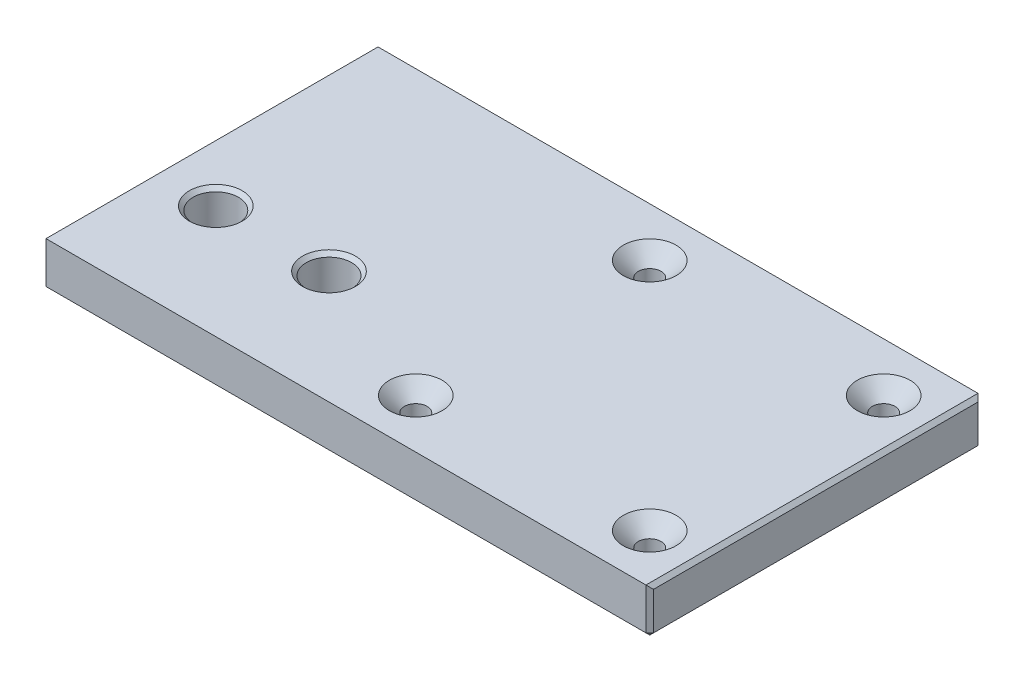
ISO-10303-21;
HEADER;
FILE_DESCRIPTION(('STEP AP214'),'2;1');
FILE_NAME('part.step','',(''),(''),'','','');
FILE_SCHEMA(('AUTOMOTIVE_DESIGN { 1 0 10303 214 1 1 1 1 }'));
ENDSEC;
DATA;
#1=APPLICATION_CONTEXT('core data for automotive mechanical design processes');
#2=APPLICATION_PROTOCOL_DEFINITION('international standard','automotive_design',2000,#1);
#3=PRODUCT_CONTEXT('',#1,'mechanical');
#4=PRODUCT('Part','Part','',(#3));
#5=PRODUCT_RELATED_PRODUCT_CATEGORY('part','',(#4));
#6=PRODUCT_DEFINITION_FORMATION('','',#4);
#7=PRODUCT_DEFINITION_CONTEXT('part definition',#1,'design');
#8=PRODUCT_DEFINITION('design','',#6,#7);
#9=PRODUCT_DEFINITION_SHAPE('','',#8);
#10=(LENGTH_UNIT() NAMED_UNIT(*) SI_UNIT(.MILLI.,.METRE.));
#11=(NAMED_UNIT(*) PLANE_ANGLE_UNIT() SI_UNIT($,.RADIAN.));
#12=(NAMED_UNIT(*) SI_UNIT($,.STERADIAN.) SOLID_ANGLE_UNIT());
#13=UNCERTAINTY_MEASURE_WITH_UNIT(LENGTH_MEASURE(1.E-05),#10,'distance_accuracy_value','');
#14=(GEOMETRIC_REPRESENTATION_CONTEXT(3) GLOBAL_UNCERTAINTY_ASSIGNED_CONTEXT((#13)) GLOBAL_UNIT_ASSIGNED_CONTEXT((#10,
#11,#12)) REPRESENTATION_CONTEXT('',''));
#15=CARTESIAN_POINT('',(0.,0.,0.));
#16=DIRECTION('',(0.,0.,1.));
#17=DIRECTION('',(1.,0.,0.));
#18=AXIS2_PLACEMENT_3D('',#15,#16,#17);
#19=CARTESIAN_POINT('',(0.,6.,0.));
#20=DIRECTION('',(0.,1.,0.));
#21=DIRECTION('',(0.,0.,1.));
#22=AXIS2_PLACEMENT_3D('',#19,#20,#21);
#23=PLANE('',#22);
#24=CARTESIAN_POINT('',(41.2716863076412,6.,16.7214611872146));
#25=DIRECTION('',(0.,1.,0.));
#26=DIRECTION('',(0.,0.,1.));
#27=AXIS2_PLACEMENT_3D('',#24,#25,#26);
#28=CIRCLE('',#27,3.50000000000002);
#29=CARTESIAN_POINT('',(41.2716863076412,6.,20.2214611872146));
#30=VERTEX_POINT('',#29);
#31=EDGE_CURVE('E265',#30,#30,#28,.F.);
#32=ORIENTED_EDGE('',*,*,#31,.T.);
#33=EDGE_LOOP('',(#32));
#34=FACE_BOUND('',#33,.T.);
#35=CARTESIAN_POINT('',(41.2716863076412,6.,-14.2785388127854));
#36=DIRECTION('',(0.,1.,0.));
#37=DIRECTION('',(0.,0.,1.));
#38=AXIS2_PLACEMENT_3D('',#35,#36,#37);
#39=CIRCLE('',#38,3.50000000000002);
#40=CARTESIAN_POINT('',(41.2716863076412,6.,-10.7785388127854));
#41=VERTEX_POINT('',#40);
#42=EDGE_CURVE('E262',#41,#41,#39,.F.);
#43=ORIENTED_EDGE('',*,*,#42,.T.);
#44=EDGE_LOOP('',(#43));
#45=FACE_BOUND('',#44,.T.);
#46=CARTESIAN_POINT('',(10.2716863076412,6.,16.7214611872146));
#47=DIRECTION('',(0.,1.,0.));
#48=DIRECTION('',(0.,0.,1.));
#49=AXIS2_PLACEMENT_3D('',#46,#47,#48);
#50=CIRCLE('',#49,3.50000000000002);
#51=CARTESIAN_POINT('',(10.2716863076412,6.,20.2214611872146));
#52=VERTEX_POINT('',#51);
#53=EDGE_CURVE('E259',#52,#52,#50,.F.);
#54=ORIENTED_EDGE('',*,*,#53,.T.);
#55=EDGE_LOOP('',(#54));
#56=FACE_BOUND('',#55,.T.);
#57=CARTESIAN_POINT('',(10.2716863076412,6.,-14.2785388127854));
#58=DIRECTION('',(0.,1.,0.));
#59=DIRECTION('',(0.,0.,1.));
#60=AXIS2_PLACEMENT_3D('',#57,#58,#59);
#61=CIRCLE('',#60,3.50000000000002);
#62=CARTESIAN_POINT('',(10.2716863076412,6.,-10.7785388127854));
#63=VERTEX_POINT('',#62);
#64=EDGE_CURVE('E256',#63,#63,#61,.F.);
#65=ORIENTED_EDGE('',*,*,#64,.T.);
#66=EDGE_LOOP('',(#65));
#67=FACE_BOUND('',#66,.T.);
#68=CARTESIAN_POINT('',(-9.72831369235883,6.,8.2214611872146));
#69=DIRECTION('',(0.,1.,0.));
#70=DIRECTION('',(0.,0.,1.));
#71=AXIS2_PLACEMENT_3D('',#68,#69,#70);
#72=CIRCLE('',#71,3.5);
#73=CARTESIAN_POINT('',(-9.72831369235883,6.,11.7214611872146));
#74=VERTEX_POINT('',#73);
#75=EDGE_CURVE('E192',#74,#74,#72,.F.);
#76=ORIENTED_EDGE('',*,*,#75,.T.);
#77=EDGE_LOOP('',(#76));
#78=FACE_BOUND('',#77,.T.);
#79=CARTESIAN_POINT('',(-24.7283136923588,6.,8.2214611872146));
#80=DIRECTION('',(0.,1.,0.));
#81=DIRECTION('',(0.,0.,1.));
#82=AXIS2_PLACEMENT_3D('',#79,#80,#81);
#83=CIRCLE('',#82,3.5);
#84=CARTESIAN_POINT('',(-24.7283136923588,6.,11.7214611872146));
#85=VERTEX_POINT('',#84);
#86=EDGE_CURVE('E189',#85,#85,#83,.F.);
#87=ORIENTED_EDGE('',*,*,#86,.T.);
#88=EDGE_LOOP('',(#87));
#89=FACE_BOUND('',#88,.T.);
#90=DIRECTION('',(-1.,0.,0.));
#91=VECTOR('',#90,1.);
#92=CARTESIAN_POINT('',(-32.7283136923588,6.,-20.7785388127854));
#93=LINE('',#92,#91);
#94=CARTESIAN_POINT('',(47.2716863076412,6.,-20.7785388127854));
#95=VERTEX_POINT('',#94);
#96=CARTESIAN_POINT('',(-32.2283136923588,6.,-20.7785388127854));
#97=VERTEX_POINT('',#96);
#98=EDGE_CURVE('E464',#95,#97,#93,.T.);
#99=ORIENTED_EDGE('',*,*,#98,.T.);
#100=DIRECTION('',(0.,0.,1.));
#101=VECTOR('',#100,1.);
#102=CARTESIAN_POINT('',(-32.2283136923588,6.,23.2214611872146));
#103=LINE('',#102,#101);
#104=CARTESIAN_POINT('',(-32.2283136923588,6.,23.2214611872146));
#105=VERTEX_POINT('',#104);
#106=EDGE_CURVE('E197',#97,#105,#103,.T.);
#107=ORIENTED_EDGE('',*,*,#106,.T.);
#108=DIRECTION('',(1.,0.,0.));
#109=VECTOR('',#108,1.);
#110=CARTESIAN_POINT('',(-32.7283136923588,6.,23.2214611872146));
#111=LINE('',#110,#109);
#112=CARTESIAN_POINT('',(47.2716863076412,6.,23.2214611872146));
#113=VERTEX_POINT('',#112);
#114=EDGE_CURVE('E253',#105,#113,#111,.T.);
#115=ORIENTED_EDGE('',*,*,#114,.T.);
#116=DIRECTION('',(0.,0.,-1.));
#117=VECTOR('',#116,1.);
#118=CARTESIAN_POINT('',(47.2716863076412,6.,-20.7785388127854));
#119=LINE('',#118,#117);
#120=EDGE_CURVE('E195',#113,#95,#119,.T.);
#121=ORIENTED_EDGE('',*,*,#120,.T.);
#122=EDGE_LOOP('',(#99,#107,#115,#121));
#123=FACE_BOUND('',#122,.T.);
#124=ADVANCED_FACE('F32',(#34,#45,#56,#67,#78,#89,#123),#23,.T.);
#125=CARTESIAN_POINT('',(0.,0.,0.));
#126=DIRECTION('',(0.,1.,0.));
#127=DIRECTION('',(0.,0.,1.));
#128=AXIS2_PLACEMENT_3D('',#125,#126,#127);
#129=PLANE('',#128);
#130=CARTESIAN_POINT('',(-9.72831369235883,0.,8.2214611872146));
#131=DIRECTION('',(0.,1.,0.));
#132=DIRECTION('',(0.,0.,1.));
#133=AXIS2_PLACEMENT_3D('',#130,#131,#132);
#134=CIRCLE('',#133,3.49999999999998);
#135=CARTESIAN_POINT('',(-9.72831369235883,0.,11.7214611872146));
#136=VERTEX_POINT('',#135);
#137=EDGE_CURVE('E158',#136,#136,#134,.T.);
#138=ORIENTED_EDGE('',*,*,#137,.T.);
#139=EDGE_LOOP('',(#138));
#140=FACE_BOUND('',#139,.T.);
#141=CARTESIAN_POINT('',(41.2716863076412,0.,16.7214611872146));
#142=DIRECTION('',(0.,1.,0.));
#143=DIRECTION('',(0.,0.,1.));
#144=AXIS2_PLACEMENT_3D('',#141,#142,#143);
#145=CIRCLE('',#144,1.99999999999999);
#146=CARTESIAN_POINT('',(41.2716863076412,0.,18.7214611872146));
#147=VERTEX_POINT('',#146);
#148=EDGE_CURVE('E151',#147,#147,#145,.T.);
#149=ORIENTED_EDGE('',*,*,#148,.T.);
#150=EDGE_LOOP('',(#149));
#151=FACE_BOUND('',#150,.T.);
#152=CARTESIAN_POINT('',(41.2716863076412,0.,-14.2785388127854));
#153=DIRECTION('',(0.,1.,0.));
#154=DIRECTION('',(0.,0.,1.));
#155=AXIS2_PLACEMENT_3D('',#152,#153,#154);
#156=CIRCLE('',#155,2.);
#157=CARTESIAN_POINT('',(41.2716863076412,0.,-12.2785388127854));
#158=VERTEX_POINT('',#157);
#159=EDGE_CURVE('E148',#158,#158,#156,.T.);
#160=ORIENTED_EDGE('',*,*,#159,.T.);
#161=EDGE_LOOP('',(#160));
#162=FACE_BOUND('',#161,.T.);
#163=DIRECTION('',(0.,0.,1.));
#164=VECTOR('',#163,1.);
#165=CARTESIAN_POINT('',(47.2716863076412,0.,0.));
#166=LINE('',#165,#164);
#167=CARTESIAN_POINT('',(47.2716863076412,0.,-20.2785388127854));
#168=VERTEX_POINT('',#167);
#169=CARTESIAN_POINT('',(47.2716863076412,0.,22.7214611872146));
#170=VERTEX_POINT('',#169);
#171=EDGE_CURVE('E146',#168,#170,#166,.T.);
#172=ORIENTED_EDGE('',*,*,#171,.T.);
#173=DIRECTION('',(-1.,0.,0.));
#174=VECTOR('',#173,1.);
#175=CARTESIAN_POINT('',(0.,0.,22.7214611872146));
#176=LINE('',#175,#174);
#177=CARTESIAN_POINT('',(-32.2283136923588,0.,22.7214611872146));
#178=VERTEX_POINT('',#177);
#179=EDGE_CURVE('E138',#170,#178,#176,.T.);
#180=ORIENTED_EDGE('',*,*,#179,.T.);
#181=DIRECTION('',(0.,0.,-1.));
#182=VECTOR('',#181,1.);
#183=CARTESIAN_POINT('',(-32.2283136923588,0.,0.));
#184=LINE('',#183,#182);
#185=CARTESIAN_POINT('',(-32.2283136923588,0.,-20.2785388127854));
#186=VERTEX_POINT('',#185);
#187=EDGE_CURVE('E108',#178,#186,#184,.T.);
#188=ORIENTED_EDGE('',*,*,#187,.T.);
#189=DIRECTION('',(1.,0.,0.));
#190=VECTOR('',#189,1.);
#191=CARTESIAN_POINT('',(0.,0.,-20.2785388127854));
#192=LINE('',#191,#190);
#193=EDGE_CURVE('E120',#186,#168,#192,.T.);
#194=ORIENTED_EDGE('',*,*,#193,.T.);
#195=EDGE_LOOP('',(#172,#180,#188,#194));
#196=FACE_BOUND('',#195,.T.);
#197=CARTESIAN_POINT('',(10.2716863076412,0.,-14.2785388127854));
#198=DIRECTION('',(0.,1.,0.));
#199=DIRECTION('',(0.,0.,1.));
#200=AXIS2_PLACEMENT_3D('',#197,#198,#199);
#201=CIRCLE('',#200,2.);
#202=CARTESIAN_POINT('',(10.2716863076412,0.,-12.2785388127854));
#203=VERTEX_POINT('',#202);
#204=EDGE_CURVE('E121',#203,#203,#201,.T.);
#205=ORIENTED_EDGE('',*,*,#204,.T.);
#206=EDGE_LOOP('',(#205));
#207=FACE_BOUND('',#206,.T.);
#208=CARTESIAN_POINT('',(10.2716863076412,0.,16.7214611872146));
#209=DIRECTION('',(0.,1.,0.));
#210=DIRECTION('',(0.,0.,1.));
#211=AXIS2_PLACEMENT_3D('',#208,#209,#210);
#212=CIRCLE('',#211,1.99999999999999);
#213=CARTESIAN_POINT('',(10.2716863076412,0.,18.7214611872146));
#214=VERTEX_POINT('',#213);
#215=EDGE_CURVE('E447',#214,#214,#212,.T.);
#216=ORIENTED_EDGE('',*,*,#215,.T.);
#217=EDGE_LOOP('',(#216));
#218=FACE_BOUND('',#217,.T.);
#219=CARTESIAN_POINT('',(-24.7283136923588,0.,8.2214611872146));
#220=DIRECTION('',(0.,1.,0.));
#221=DIRECTION('',(0.,0.,1.));
#222=AXIS2_PLACEMENT_3D('',#219,#220,#221);
#223=CIRCLE('',#222,3.49999999999998);
#224=CARTESIAN_POINT('',(-24.7283136923588,0.,11.7214611872146));
#225=VERTEX_POINT('',#224);
#226=EDGE_CURVE('E450',#225,#225,#223,.T.);
#227=ORIENTED_EDGE('',*,*,#226,.T.);
#228=EDGE_LOOP('',(#227));
#229=FACE_BOUND('',#228,.T.);
#230=ADVANCED_FACE('F143',(#140,#151,#162,#196,#207,#218,#229),#129,.F.);
#231=CARTESIAN_POINT('',(-32.7283136923588,6.,-20.7785388127854));
#232=DIRECTION('',(1.,0.,0.));
#233=DIRECTION('',(0.,0.,-1.));
#234=AXIS2_PLACEMENT_3D('',#231,#232,#233);
#235=PLANE('',#234);
#236=DIRECTION('',(0.,0.,-1.));
#237=VECTOR('',#236,1.);
#238=CARTESIAN_POINT('',(-32.7283136923588,5.5,-20.7785388127854));
#239=LINE('',#238,#237);
#240=CARTESIAN_POINT('',(-32.7283136923588,5.5,22.7214611872146));
#241=VERTEX_POINT('',#240);
#242=CARTESIAN_POINT('',(-32.7283136923588,5.5,-20.2785388127854));
#243=VERTEX_POINT('',#242);
#244=EDGE_CURVE('E177',#241,#243,#239,.T.);
#245=ORIENTED_EDGE('',*,*,#244,.T.);
#246=DIRECTION('',(0.,-1.,0.));
#247=VECTOR('',#246,1.);
#248=CARTESIAN_POINT('',(-32.7283136923588,6.,-20.2785388127854));
#249=LINE('',#248,#247);
#250=CARTESIAN_POINT('',(-32.7283136923588,0.5,-20.2785388127854));
#251=VERTEX_POINT('',#250);
#252=EDGE_CURVE('E179',#243,#251,#249,.T.);
#253=ORIENTED_EDGE('',*,*,#252,.T.);
#254=DIRECTION('',(0.,0.,1.));
#255=VECTOR('',#254,1.);
#256=CARTESIAN_POINT('',(-32.7283136923588,0.5,-20.7785388127854));
#257=LINE('',#256,#255);
#258=CARTESIAN_POINT('',(-32.7283136923588,0.5,22.7214611872146));
#259=VERTEX_POINT('',#258);
#260=EDGE_CURVE('E173',#251,#259,#257,.T.);
#261=ORIENTED_EDGE('',*,*,#260,.T.);
#262=DIRECTION('',(0.,1.,0.));
#263=VECTOR('',#262,1.);
#264=CARTESIAN_POINT('',(-32.7283136923588,6.,22.7214611872146));
#265=LINE('',#264,#263);
#266=EDGE_CURVE('E175',#259,#241,#265,.T.);
#267=ORIENTED_EDGE('',*,*,#266,.T.);
#268=EDGE_LOOP('',(#245,#253,#261,#267));
#269=FACE_BOUND('',#268,.T.);
#270=ADVANCED_FACE('F295',(#269),#235,.F.);
#271=CARTESIAN_POINT('',(-32.7283136923588,6.,23.2214611872146));
#272=DIRECTION('',(0.,0.,-1.));
#273=DIRECTION('',(-1.,0.,0.));
#274=AXIS2_PLACEMENT_3D('',#271,#272,#273);
#275=PLANE('',#274);
#276=ORIENTED_EDGE('',*,*,#114,.F.);
#277=DIRECTION('',(0.,-1.,0.));
#278=VECTOR('',#277,1.);
#279=CARTESIAN_POINT('',(-32.2283136923588,6.,23.2214611872146));
#280=LINE('',#279,#278);
#281=CARTESIAN_POINT('',(-32.2283136923588,0.5,23.2214611872146));
#282=VERTEX_POINT('',#281);
#283=EDGE_CURVE('E202',#105,#282,#280,.T.);
#284=ORIENTED_EDGE('',*,*,#283,.T.);
#285=DIRECTION('',(1.,0.,0.));
#286=VECTOR('',#285,1.);
#287=CARTESIAN_POINT('',(-32.7283136923588,0.5,23.2214611872146));
#288=LINE('',#287,#286);
#289=CARTESIAN_POINT('',(47.2716863076412,0.5,23.2214611872146));
#290=VERTEX_POINT('',#289);
#291=EDGE_CURVE('E139',#282,#290,#288,.T.);
#292=ORIENTED_EDGE('',*,*,#291,.T.);
#293=DIRECTION('',(0.,1.,0.));
#294=VECTOR('',#293,1.);
#295=CARTESIAN_POINT('',(47.2716863076412,6.,23.2214611872146));
#296=LINE('',#295,#294);
#297=EDGE_CURVE('E200',#290,#113,#296,.T.);
#298=ORIENTED_EDGE('',*,*,#297,.T.);
#299=EDGE_LOOP('',(#276,#284,#292,#298));
#300=FACE_BOUND('',#299,.T.);
#301=ADVANCED_FACE('F310',(#300),#275,.F.);
#302=CARTESIAN_POINT('',(47.7716863076412,6.,-20.7785388127854));
#303=DIRECTION('',(-1.,0.,0.));
#304=DIRECTION('',(0.,0.,1.));
#305=AXIS2_PLACEMENT_3D('',#302,#303,#304);
#306=PLANE('',#305);
#307=DIRECTION('',(0.,0.,1.));
#308=VECTOR('',#307,1.);
#309=CARTESIAN_POINT('',(47.7716863076412,5.5,23.2214611872146));
#310=LINE('',#309,#308);
#311=CARTESIAN_POINT('',(47.7716863076412,5.5,-20.2785388127854));
#312=VERTEX_POINT('',#311);
#313=CARTESIAN_POINT('',(47.7716863076412,5.5,22.7214611872146));
#314=VERTEX_POINT('',#313);
#315=EDGE_CURVE('E47',#312,#314,#310,.T.);
#316=ORIENTED_EDGE('',*,*,#315,.T.);
#317=DIRECTION('',(0.,-1.,0.));
#318=VECTOR('',#317,1.);
#319=CARTESIAN_POINT('',(47.7716863076412,6.,22.7214611872146));
#320=LINE('',#319,#318);
#321=CARTESIAN_POINT('',(47.7716863076412,0.5,22.7214611872146));
#322=VERTEX_POINT('',#321);
#323=EDGE_CURVE('E208',#314,#322,#320,.T.);
#324=ORIENTED_EDGE('',*,*,#323,.T.);
#325=DIRECTION('',(0.,0.,-1.));
#326=VECTOR('',#325,1.);
#327=CARTESIAN_POINT('',(47.7716863076412,0.5,-20.7785388127854));
#328=LINE('',#327,#326);
#329=CARTESIAN_POINT('',(47.7716863076412,0.5,-20.2785388127854));
#330=VERTEX_POINT('',#329);
#331=EDGE_CURVE('E204',#322,#330,#328,.T.);
#332=ORIENTED_EDGE('',*,*,#331,.T.);
#333=DIRECTION('',(0.,1.,0.));
#334=VECTOR('',#333,1.);
#335=CARTESIAN_POINT('',(47.7716863076412,6.,-20.2785388127854));
#336=LINE('',#335,#334);
#337=EDGE_CURVE('E52',#330,#312,#336,.T.);
#338=ORIENTED_EDGE('',*,*,#337,.T.);
#339=EDGE_LOOP('',(#316,#324,#332,#338));
#340=FACE_BOUND('',#339,.T.);
#341=ADVANCED_FACE('F306',(#340),#306,.F.);
#342=CARTESIAN_POINT('',(-32.7283136923588,6.,-20.7785388127854));
#343=DIRECTION('',(0.,0.,1.));
#344=DIRECTION('',(1.,0.,0.));
#345=AXIS2_PLACEMENT_3D('',#342,#343,#344);
#346=PLANE('',#345);
#347=DIRECTION('',(-1.,0.,0.));
#348=VECTOR('',#347,1.);
#349=CARTESIAN_POINT('',(-32.7283136923588,0.5,-20.7785388127854));
#350=LINE('',#349,#348);
#351=CARTESIAN_POINT('',(47.2716863076412,0.5,-20.7785388127854));
#352=VERTEX_POINT('',#351);
#353=CARTESIAN_POINT('',(-32.2283136923588,0.5,-20.7785388127854));
#354=VERTEX_POINT('',#353);
#355=EDGE_CURVE('E182',#352,#354,#350,.T.);
#356=ORIENTED_EDGE('',*,*,#355,.T.);
#357=DIRECTION('',(0.,1.,0.));
#358=VECTOR('',#357,1.);
#359=CARTESIAN_POINT('',(-32.2283136923588,6.,-20.7785388127854));
#360=LINE('',#359,#358);
#361=EDGE_CURVE('E186',#354,#97,#360,.T.);
#362=ORIENTED_EDGE('',*,*,#361,.T.);
#363=ORIENTED_EDGE('',*,*,#98,.F.);
#364=DIRECTION('',(0.,-1.,0.));
#365=VECTOR('',#364,1.);
#366=CARTESIAN_POINT('',(47.2716863076412,6.,-20.7785388127854));
#367=LINE('',#366,#365);
#368=EDGE_CURVE('E184',#95,#352,#367,.T.);
#369=ORIENTED_EDGE('',*,*,#368,.T.);
#370=EDGE_LOOP('',(#356,#362,#363,#369));
#371=FACE_BOUND('',#370,.T.);
#372=ADVANCED_FACE('F303',(#371),#346,.F.);
#373=CARTESIAN_POINT('',(10.2716863076412,6.,-14.2785388127854));
#374=DIRECTION('',(0.,-1.,0.));
#375=DIRECTION('',(0.,0.,-1.));
#376=AXIS2_PLACEMENT_3D('',#373,#374,#375);
#377=CYLINDRICAL_SURFACE('',#376,1.5);
#378=CARTESIAN_POINT('',(10.2716863076412,4.00000000000001,-14.2785388127854));
#379=DIRECTION('',(0.,1.,0.));
#380=DIRECTION('',(0.,0.,1.));
#381=AXIS2_PLACEMENT_3D('',#378,#379,#380);
#382=CIRCLE('',#381,1.5);
#383=CARTESIAN_POINT('',(10.2716863076412,4.00000000000001,-12.7785388127854));
#384=VERTEX_POINT('',#383);
#385=EDGE_CURVE('E11',#384,#384,#382,.T.);
#386=ORIENTED_EDGE('',*,*,#385,.T.);
#387=EDGE_LOOP('',(#386));
#388=FACE_BOUND('',#387,.T.);
#389=CARTESIAN_POINT('',(10.2716863076412,0.5,-14.2785388127854));
#390=DIRECTION('',(0.,1.,0.));
#391=DIRECTION('',(0.,0.,1.));
#392=AXIS2_PLACEMENT_3D('',#389,#390,#391);
#393=CIRCLE('',#392,1.5);
#394=CARTESIAN_POINT('',(10.2716863076412,0.5,-12.7785388127854));
#395=VERTEX_POINT('',#394);
#396=EDGE_CURVE('E210',#395,#395,#393,.F.);
#397=ORIENTED_EDGE('',*,*,#396,.T.);
#398=EDGE_LOOP('',(#397));
#399=FACE_BOUND('',#398,.T.);
#400=ADVANCED_FACE('F300',(#388,#399),#377,.F.);
#401=CARTESIAN_POINT('',(41.2716863076412,6.,-14.2785388127854));
#402=DIRECTION('',(0.,-1.,0.));
#403=DIRECTION('',(0.,0.,-1.));
#404=AXIS2_PLACEMENT_3D('',#401,#402,#403);
#405=CYLINDRICAL_SURFACE('',#404,1.5);
#406=CARTESIAN_POINT('',(41.2716863076412,4.00000000000001,-14.2785388127854));
#407=DIRECTION('',(0.,1.,0.));
#408=DIRECTION('',(0.,0.,1.));
#409=AXIS2_PLACEMENT_3D('',#406,#407,#408);
#410=CIRCLE('',#409,1.5);
#411=CARTESIAN_POINT('',(41.2716863076412,4.00000000000001,-12.7785388127854));
#412=VERTEX_POINT('',#411);
#413=EDGE_CURVE('E268',#412,#412,#410,.T.);
#414=ORIENTED_EDGE('',*,*,#413,.T.);
#415=EDGE_LOOP('',(#414));
#416=FACE_BOUND('',#415,.T.);
#417=CARTESIAN_POINT('',(41.2716863076412,0.499999999999996,-14.2785388127854));
#418=DIRECTION('',(0.,1.,0.));
#419=DIRECTION('',(0.,0.,1.));
#420=AXIS2_PLACEMENT_3D('',#417,#418,#419);
#421=CIRCLE('',#420,1.5);
#422=CARTESIAN_POINT('',(41.2716863076412,0.499999999999996,-12.7785388127854));
#423=VERTEX_POINT('',#422);
#424=EDGE_CURVE('E170',#423,#423,#421,.F.);
#425=ORIENTED_EDGE('',*,*,#424,.T.);
#426=EDGE_LOOP('',(#425));
#427=FACE_BOUND('',#426,.T.);
#428=ADVANCED_FACE('F426',(#416,#427),#405,.F.);
#429=CARTESIAN_POINT('',(10.2716863076412,6.,16.7214611872146));
#430=DIRECTION('',(0.,-1.,0.));
#431=DIRECTION('',(0.,0.,-1.));
#432=AXIS2_PLACEMENT_3D('',#429,#430,#431);
#433=CYLINDRICAL_SURFACE('',#432,1.5);
#434=CARTESIAN_POINT('',(10.2716863076412,4.00000000000001,16.7214611872146));
#435=DIRECTION('',(0.,1.,0.));
#436=DIRECTION('',(0.,0.,1.));
#437=AXIS2_PLACEMENT_3D('',#434,#435,#436);
#438=CIRCLE('',#437,1.5);
#439=CARTESIAN_POINT('',(10.2716863076412,4.00000000000001,18.2214611872146));
#440=VERTEX_POINT('',#439);
#441=EDGE_CURVE('E40',#440,#440,#438,.T.);
#442=ORIENTED_EDGE('',*,*,#441,.T.);
#443=EDGE_LOOP('',(#442));
#444=FACE_BOUND('',#443,.T.);
#445=CARTESIAN_POINT('',(10.2716863076412,0.499999999999982,16.7214611872146));
#446=DIRECTION('',(0.,1.,0.));
#447=DIRECTION('',(0.,0.,1.));
#448=AXIS2_PLACEMENT_3D('',#445,#446,#447);
#449=CIRCLE('',#448,1.5);
#450=CARTESIAN_POINT('',(10.2716863076412,0.499999999999982,18.2214611872146));
#451=VERTEX_POINT('',#450);
#452=EDGE_CURVE('E213',#451,#451,#449,.F.);
#453=ORIENTED_EDGE('',*,*,#452,.T.);
#454=EDGE_LOOP('',(#453));
#455=FACE_BOUND('',#454,.T.);
#456=ADVANCED_FACE('F273',(#444,#455),#433,.F.);
#457=CARTESIAN_POINT('',(41.2716863076412,6.,16.7214611872146));
#458=DIRECTION('',(0.,-1.,0.));
#459=DIRECTION('',(0.,0.,-1.));
#460=AXIS2_PLACEMENT_3D('',#457,#458,#459);
#461=CYLINDRICAL_SURFACE('',#460,1.5);
#462=CARTESIAN_POINT('',(41.2716863076412,4.00000000000001,16.7214611872146));
#463=DIRECTION('',(0.,1.,0.));
#464=DIRECTION('',(0.,0.,1.));
#465=AXIS2_PLACEMENT_3D('',#462,#463,#464);
#466=CIRCLE('',#465,1.5);
#467=CARTESIAN_POINT('',(41.2716863076412,4.00000000000001,18.2214611872146));
#468=VERTEX_POINT('',#467);
#469=EDGE_CURVE('E222',#468,#468,#466,.T.);
#470=ORIENTED_EDGE('',*,*,#469,.T.);
#471=EDGE_LOOP('',(#470));
#472=FACE_BOUND('',#471,.T.);
#473=CARTESIAN_POINT('',(41.2716863076412,0.499999999999979,16.7214611872146));
#474=DIRECTION('',(0.,1.,0.));
#475=DIRECTION('',(0.,0.,1.));
#476=AXIS2_PLACEMENT_3D('',#473,#474,#475);
#477=CIRCLE('',#476,1.5);
#478=CARTESIAN_POINT('',(41.2716863076412,0.499999999999979,18.2214611872146));
#479=VERTEX_POINT('',#478);
#480=EDGE_CURVE('E167',#479,#479,#477,.F.);
#481=ORIENTED_EDGE('',*,*,#480,.T.);
#482=EDGE_LOOP('',(#481));
#483=FACE_BOUND('',#482,.T.);
#484=ADVANCED_FACE('F408',(#472,#483),#461,.F.);
#485=CARTESIAN_POINT('',(-24.7283136923588,6.,8.2214611872146));
#486=DIRECTION('',(0.,-1.,0.));
#487=DIRECTION('',(0.,0.,-1.));
#488=AXIS2_PLACEMENT_3D('',#485,#486,#487);
#489=CYLINDRICAL_SURFACE('',#488,2.99999999999999);
#490=CARTESIAN_POINT('',(-24.7283136923588,0.499999999999992,8.2214611872146));
#491=DIRECTION('',(0.,1.,0.));
#492=DIRECTION('',(0.,0.,1.));
#493=AXIS2_PLACEMENT_3D('',#490,#491,#492);
#494=CIRCLE('',#493,2.99999999999999);
#495=CARTESIAN_POINT('',(-24.7283136923588,0.499999999999992,11.2214611872146));
#496=VERTEX_POINT('',#495);
#497=EDGE_CURVE('E219',#496,#496,#494,.F.);
#498=ORIENTED_EDGE('',*,*,#497,.T.);
#499=EDGE_LOOP('',(#498));
#500=FACE_BOUND('',#499,.T.);
#501=CARTESIAN_POINT('',(-24.7283136923588,5.49999999999999,8.2214611872146));
#502=DIRECTION('',(0.,1.,0.));
#503=DIRECTION('',(0.,0.,1.));
#504=AXIS2_PLACEMENT_3D('',#501,#502,#503);
#505=CIRCLE('',#504,2.99999999999999);
#506=CARTESIAN_POINT('',(-24.7283136923588,5.49999999999999,11.2214611872146));
#507=VERTEX_POINT('',#506);
#508=EDGE_CURVE('E216',#507,#507,#505,.T.);
#509=ORIENTED_EDGE('',*,*,#508,.T.);
#510=EDGE_LOOP('',(#509));
#511=FACE_BOUND('',#510,.T.);
#512=ADVANCED_FACE('F411',(#500,#511),#489,.F.);
#513=CARTESIAN_POINT('',(-9.72831369235883,6.,8.2214611872146));
#514=DIRECTION('',(0.,-1.,0.));
#515=DIRECTION('',(0.,0.,-1.));
#516=AXIS2_PLACEMENT_3D('',#513,#514,#515);
#517=CYLINDRICAL_SURFACE('',#516,2.99999999999999);
#518=CARTESIAN_POINT('',(-9.72831369235883,0.499999999999992,8.2214611872146));
#519=DIRECTION('',(0.,1.,0.));
#520=DIRECTION('',(0.,0.,1.));
#521=AXIS2_PLACEMENT_3D('',#518,#519,#520);
#522=CIRCLE('',#521,2.99999999999999);
#523=CARTESIAN_POINT('',(-9.72831369235883,0.499999999999992,11.2214611872146));
#524=VERTEX_POINT('',#523);
#525=EDGE_CURVE('E164',#524,#524,#522,.F.);
#526=ORIENTED_EDGE('',*,*,#525,.T.);
#527=EDGE_LOOP('',(#526));
#528=FACE_BOUND('',#527,.T.);
#529=CARTESIAN_POINT('',(-9.72831369235883,5.49999999999999,8.2214611872146));
#530=DIRECTION('',(0.,1.,0.));
#531=DIRECTION('',(0.,0.,1.));
#532=AXIS2_PLACEMENT_3D('',#529,#530,#531);
#533=CIRCLE('',#532,2.99999999999999);
#534=CARTESIAN_POINT('',(-9.72831369235883,5.49999999999999,11.2214611872146));
#535=VERTEX_POINT('',#534);
#536=EDGE_CURVE('E161',#535,#535,#533,.T.);
#537=ORIENTED_EDGE('',*,*,#536,.T.);
#538=EDGE_LOOP('',(#537));
#539=FACE_BOUND('',#538,.T.);
#540=ADVANCED_FACE('F321',(#528,#539),#517,.F.);
#541=CARTESIAN_POINT('',(-9.72831369235883,0.,8.2214611872146));
#542=DIRECTION('',(0.,-1.,0.));
#543=DIRECTION('',(0.,0.,-1.));
#544=AXIS2_PLACEMENT_3D('',#541,#542,#543);
#545=CONICAL_SURFACE('',#544,3.49999999999998,0.785398163397445);
#546=ORIENTED_EDGE('',*,*,#525,.F.);
#547=EDGE_LOOP('',(#546));
#548=FACE_BOUND('',#547,.T.);
#549=ORIENTED_EDGE('',*,*,#137,.F.);
#550=EDGE_LOOP('',(#549));
#551=FACE_BOUND('',#550,.T.);
#552=ADVANCED_FACE('F317',(#548,#551),#545,.F.);
#553=CARTESIAN_POINT('',(41.2716863076412,0.,16.7214611872146));
#554=DIRECTION('',(0.,-1.,0.));
#555=DIRECTION('',(0.,0.,-1.));
#556=AXIS2_PLACEMENT_3D('',#553,#554,#555);
#557=CONICAL_SURFACE('',#556,1.99999999999999,0.785398163397453);
#558=ORIENTED_EDGE('',*,*,#480,.F.);
#559=EDGE_LOOP('',(#558));
#560=FACE_BOUND('',#559,.T.);
#561=ORIENTED_EDGE('',*,*,#148,.F.);
#562=EDGE_LOOP('',(#561));
#563=FACE_BOUND('',#562,.T.);
#564=ADVANCED_FACE('F320',(#560,#563),#557,.F.);
#565=CARTESIAN_POINT('',(41.2716863076412,0.,-14.2785388127854));
#566=DIRECTION('',(0.,-1.,0.));
#567=DIRECTION('',(0.,0.,-1.));
#568=AXIS2_PLACEMENT_3D('',#565,#566,#567);
#569=CONICAL_SURFACE('',#568,2.,0.78539816339745);
#570=ORIENTED_EDGE('',*,*,#424,.F.);
#571=EDGE_LOOP('',(#570));
#572=FACE_BOUND('',#571,.T.);
#573=ORIENTED_EDGE('',*,*,#159,.F.);
#574=EDGE_LOOP('',(#573));
#575=FACE_BOUND('',#574,.T.);
#576=ADVANCED_FACE('F325',(#572,#575),#569,.F.);
#577=CARTESIAN_POINT('',(47.7716863076412,6.,22.7214611872146));
#578=DIRECTION('',(-0.707106781186547,0.,-0.707106781186547));
#579=DIRECTION('',(0.,-1.,0.));
#580=AXIS2_PLACEMENT_3D('',#577,#578,#579);
#581=PLANE('',#580);
#582=DIRECTION('',(0.707106781186547,0.,-0.707106781186547));
#583=VECTOR('',#582,1.);
#584=CARTESIAN_POINT('',(47.7716863076412,0.5,22.7214611872146));
#585=LINE('',#584,#583);
#586=EDGE_CURVE('E250',#322,#290,#585,.F.);
#587=ORIENTED_EDGE('',*,*,#586,.F.);
#588=ORIENTED_EDGE('',*,*,#323,.F.);
#589=DIRECTION('',(-0.577350269189627,0.577350269189623,0.577350269189627));
#590=VECTOR('',#589,1.);
#591=CARTESIAN_POINT('',(55.0121733700461,-1.74048706240485,15.4809741248097));
#592=LINE('',#591,#590);
#593=EDGE_CURVE('E247',#113,#314,#592,.F.);
#594=ORIENTED_EDGE('',*,*,#593,.F.);
#595=ORIENTED_EDGE('',*,*,#297,.F.);
#596=EDGE_LOOP('',(#587,#588,#594,#595));
#597=FACE_BOUND('',#596,.T.);
#598=ADVANCED_FACE('F329',(#597),#581,.F.);
#599=CARTESIAN_POINT('',(47.7716863076412,0.5,22.7214611872146));
#600=DIRECTION('',(0.577350269189626,-0.577350269189626,0.577350269189626));
#601=DIRECTION('',(0.707106781186547,0.,-0.707106781186547));
#602=AXIS2_PLACEMENT_3D('',#599,#600,#601);
#603=PLANE('',#602);
#604=DIRECTION('',(-0.70710678118655,-0.707106781186545,0.));
#605=VECTOR('',#604,1.);
#606=CARTESIAN_POINT('',(47.7716863076412,0.5,22.7214611872146));
#607=LINE('',#606,#605);
#608=EDGE_CURVE('E243',#322,#170,#607,.T.);
#609=ORIENTED_EDGE('',*,*,#608,.F.);
#610=ORIENTED_EDGE('',*,*,#586,.T.);
#611=DIRECTION('',(0.,0.707106781186547,0.707106781186547));
#612=VECTOR('',#611,1.);
#613=CARTESIAN_POINT('',(47.2716863076412,0.25,22.9714611872146));
#614=LINE('',#613,#612);
#615=EDGE_CURVE('E245',#170,#290,#614,.T.);
#616=ORIENTED_EDGE('',*,*,#615,.F.);
#617=EDGE_LOOP('',(#609,#610,#616));
#618=FACE_BOUND('',#617,.T.);
#619=ADVANCED_FACE('F373',(#618),#603,.T.);
#620=CARTESIAN_POINT('',(47.2716863076412,6.,0.));
#621=DIRECTION('',(0.707106781186545,0.70710678118655,0.));
#622=DIRECTION('',(0.,0.,1.));
#623=AXIS2_PLACEMENT_3D('',#620,#621,#622);
#624=PLANE('',#623);
#625=ORIENTED_EDGE('',*,*,#593,.T.);
#626=ORIENTED_EDGE('',*,*,#315,.F.);
#627=DIRECTION('',(-0.577350269189627,0.577350269189623,-0.577350269189627));
#628=VECTOR('',#627,1.);
#629=CARTESIAN_POINT('',(47.2716863076412,6.,-20.7785388127854));
#630=LINE('',#629,#628);
#631=EDGE_CURVE('E140',#95,#312,#630,.F.);
#632=ORIENTED_EDGE('',*,*,#631,.F.);
#633=ORIENTED_EDGE('',*,*,#120,.F.);
#634=EDGE_LOOP('',(#625,#626,#632,#633));
#635=FACE_BOUND('',#634,.T.);
#636=ADVANCED_FACE('F370',(#635),#624,.T.);
#637=CARTESIAN_POINT('',(-32.7283136923588,0.5,23.2214611872146));
#638=DIRECTION('',(0.,0.707106781186547,-0.707106781186547));
#639=DIRECTION('',(1.,0.,0.));
#640=AXIS2_PLACEMENT_3D('',#637,#638,#639);
#641=PLANE('',#640);
#642=ORIENTED_EDGE('',*,*,#615,.T.);
#643=ORIENTED_EDGE('',*,*,#291,.F.);
#644=DIRECTION('',(0.,-0.707106781186547,-0.707106781186547));
#645=VECTOR('',#644,1.);
#646=CARTESIAN_POINT('',(-32.2283136923588,0.5,23.2214611872146));
#647=LINE('',#646,#645);
#648=EDGE_CURVE('E127',#178,#282,#647,.F.);
#649=ORIENTED_EDGE('',*,*,#648,.F.);
#650=ORIENTED_EDGE('',*,*,#179,.F.);
#651=EDGE_LOOP('',(#642,#643,#649,#650));
#652=FACE_BOUND('',#651,.T.);
#653=ADVANCED_FACE('F137',(#652),#641,.F.);
#654=CARTESIAN_POINT('',(47.7716863076412,0.5,-20.7785388127854));
#655=DIRECTION('',(-0.707106781186545,0.70710678118655,0.));
#656=DIRECTION('',(0.,0.,-1.));
#657=AXIS2_PLACEMENT_3D('',#654,#655,#656);
#658=PLANE('',#657);
#659=ORIENTED_EDGE('',*,*,#608,.T.);
#660=ORIENTED_EDGE('',*,*,#171,.F.);
#661=DIRECTION('',(0.70710678118655,0.707106781186545,0.));
#662=VECTOR('',#661,1.);
#663=CARTESIAN_POINT('',(47.5216863076412,0.249999999999999,-20.2785388127854));
#664=LINE('',#663,#662);
#665=EDGE_CURVE('E141',#330,#168,#664,.F.);
#666=ORIENTED_EDGE('',*,*,#665,.F.);
#667=ORIENTED_EDGE('',*,*,#331,.F.);
#668=EDGE_LOOP('',(#659,#660,#666,#667));
#669=FACE_BOUND('',#668,.T.);
#670=ADVANCED_FACE('F363',(#669),#658,.F.);
#671=CARTESIAN_POINT('',(47.2716863076412,6.,-20.7785388127854));
#672=DIRECTION('',(-0.707106781186547,0.,0.707106781186547));
#673=DIRECTION('',(0.,-1.,0.));
#674=AXIS2_PLACEMENT_3D('',#671,#672,#673);
#675=PLANE('',#674);
#676=ORIENTED_EDGE('',*,*,#631,.T.);
#677=ORIENTED_EDGE('',*,*,#337,.F.);
#678=DIRECTION('',(-0.707106781186547,0.,-0.707106781186547));
#679=VECTOR('',#678,1.);
#680=CARTESIAN_POINT('',(47.2716863076412,0.5,-20.7785388127854));
#681=LINE('',#680,#679);
#682=EDGE_CURVE('E236',#352,#330,#681,.F.);
#683=ORIENTED_EDGE('',*,*,#682,.F.);
#684=ORIENTED_EDGE('',*,*,#368,.F.);
#685=EDGE_LOOP('',(#676,#677,#683,#684));
#686=FACE_BOUND('',#685,.T.);
#687=ADVANCED_FACE('F360',(#686),#675,.F.);
#688=CARTESIAN_POINT('',(-32.2283136923588,0.5,23.2214611872146));
#689=DIRECTION('',(-0.577350269189626,-0.577350269189626,0.577350269189626));
#690=DIRECTION('',(0.707106781186547,0.,0.707106781186547));
#691=AXIS2_PLACEMENT_3D('',#688,#689,#690);
#692=PLANE('',#691);
#693=DIRECTION('',(-0.707106781186545,0.70710678118655,0.));
#694=VECTOR('',#693,1.);
#695=CARTESIAN_POINT('',(-32.4783136923588,0.250000000000002,22.7214611872146));
#696=LINE('',#695,#694);
#697=EDGE_CURVE('E112',#178,#259,#696,.T.);
#698=ORIENTED_EDGE('',*,*,#697,.F.);
#699=ORIENTED_EDGE('',*,*,#648,.T.);
#700=DIRECTION('',(0.707106781186547,0.,0.707106781186547));
#701=VECTOR('',#700,1.);
#702=CARTESIAN_POINT('',(-32.2283136923588,0.5,23.2214611872146));
#703=LINE('',#702,#701);
#704=EDGE_CURVE('E129',#259,#282,#703,.T.);
#705=ORIENTED_EDGE('',*,*,#704,.F.);
#706=EDGE_LOOP('',(#698,#699,#705));
#707=FACE_BOUND('',#706,.T.);
#708=ADVANCED_FACE('F126',(#707),#692,.T.);
#709=CARTESIAN_POINT('',(47.2716863076412,0.5,-20.7785388127854));
#710=DIRECTION('',(0.577350269189626,-0.577350269189626,-0.577350269189626));
#711=DIRECTION('',(-0.707106781186547,0.,-0.707106781186547));
#712=AXIS2_PLACEMENT_3D('',#709,#710,#711);
#713=PLANE('',#712);
#714=ORIENTED_EDGE('',*,*,#682,.T.);
#715=ORIENTED_EDGE('',*,*,#665,.T.);
#716=DIRECTION('',(0.,-0.707106781186547,0.707106781186547));
#717=VECTOR('',#716,1.);
#718=CARTESIAN_POINT('',(47.2716863076412,0.5,-20.7785388127854));
#719=LINE('',#718,#717);
#720=EDGE_CURVE('E131',#352,#168,#719,.T.);
#721=ORIENTED_EDGE('',*,*,#720,.F.);
#722=EDGE_LOOP('',(#714,#715,#721));
#723=FACE_BOUND('',#722,.T.);
#724=ADVANCED_FACE('F353',(#723),#713,.T.);
#725=CARTESIAN_POINT('',(-32.2283136923588,6.,23.2214611872146));
#726=DIRECTION('',(0.707106781186547,0.,-0.707106781186547));
#727=DIRECTION('',(0.,-1.,0.));
#728=AXIS2_PLACEMENT_3D('',#725,#726,#727);
#729=PLANE('',#728);
#730=ORIENTED_EDGE('',*,*,#704,.T.);
#731=ORIENTED_EDGE('',*,*,#283,.F.);
#732=DIRECTION('',(0.577350269189625,0.577350269189628,0.577350269189625));
#733=VECTOR('',#732,1.);
#734=CARTESIAN_POINT('',(-32.2283136923588,6.,23.2214611872146));
#735=LINE('',#734,#733);
#736=EDGE_CURVE('E230',#241,#105,#735,.T.);
#737=ORIENTED_EDGE('',*,*,#736,.F.);
#738=ORIENTED_EDGE('',*,*,#266,.F.);
#739=EDGE_LOOP('',(#730,#731,#737,#738));
#740=FACE_BOUND('',#739,.T.);
#741=ADVANCED_FACE('F350',(#740),#729,.F.);
#742=CARTESIAN_POINT('',(-32.7283136923588,0.5,-20.7785388127854));
#743=DIRECTION('',(0.70710678118655,0.707106781186545,0.));
#744=DIRECTION('',(0.,0.,1.));
#745=AXIS2_PLACEMENT_3D('',#742,#743,#744);
#746=PLANE('',#745);
#747=ORIENTED_EDGE('',*,*,#697,.T.);
#748=ORIENTED_EDGE('',*,*,#260,.F.);
#749=DIRECTION('',(0.707106781186545,-0.70710678118655,0.));
#750=VECTOR('',#749,1.);
#751=CARTESIAN_POINT('',(-32.7283136923588,0.5,-20.2785388127854));
#752=LINE('',#751,#750);
#753=EDGE_CURVE('E115',#186,#251,#752,.F.);
#754=ORIENTED_EDGE('',*,*,#753,.F.);
#755=ORIENTED_EDGE('',*,*,#187,.F.);
#756=EDGE_LOOP('',(#747,#748,#754,#755));
#757=FACE_BOUND('',#756,.T.);
#758=ADVANCED_FACE('F110',(#757),#746,.F.);
#759=CARTESIAN_POINT('',(-32.7283136923588,0.5,-20.7785388127854));
#760=DIRECTION('',(0.,0.707106781186547,0.707106781186547));
#761=DIRECTION('',(-1.,0.,0.));
#762=AXIS2_PLACEMENT_3D('',#759,#760,#761);
#763=PLANE('',#762);
#764=ORIENTED_EDGE('',*,*,#720,.T.);
#765=ORIENTED_EDGE('',*,*,#193,.F.);
#766=DIRECTION('',(0.,0.707106781186547,-0.707106781186547));
#767=VECTOR('',#766,1.);
#768=CARTESIAN_POINT('',(-32.2283136923588,0.25,-20.5285388127854));
#769=LINE('',#768,#767);
#770=EDGE_CURVE('E227',#354,#186,#769,.F.);
#771=ORIENTED_EDGE('',*,*,#770,.F.);
#772=ORIENTED_EDGE('',*,*,#355,.F.);
#773=EDGE_LOOP('',(#764,#765,#771,#772));
#774=FACE_BOUND('',#773,.T.);
#775=ADVANCED_FACE('F343',(#774),#763,.F.);
#776=CARTESIAN_POINT('',(-32.2283136923588,6.,0.));
#777=DIRECTION('',(-0.70710678118655,0.707106781186545,0.));
#778=DIRECTION('',(0.,0.,-1.));
#779=AXIS2_PLACEMENT_3D('',#776,#777,#778);
#780=PLANE('',#779);
#781=ORIENTED_EDGE('',*,*,#736,.T.);
#782=ORIENTED_EDGE('',*,*,#106,.F.);
#783=DIRECTION('',(0.577350269189625,0.577350269189628,-0.577350269189625));
#784=VECTOR('',#783,1.);
#785=CARTESIAN_POINT('',(-39.1544932966206,-0.926179604261812,-13.8523592085236));
#786=LINE('',#785,#784);
#787=EDGE_CURVE('E225',#243,#97,#786,.T.);
#788=ORIENTED_EDGE('',*,*,#787,.F.);
#789=ORIENTED_EDGE('',*,*,#244,.F.);
#790=EDGE_LOOP('',(#781,#782,#788,#789));
#791=FACE_BOUND('',#790,.T.);
#792=ADVANCED_FACE('F339',(#791),#780,.T.);
#793=CARTESIAN_POINT('',(-32.7283136923588,0.5,-20.2785388127854));
#794=DIRECTION('',(-0.577350269189626,-0.577350269189626,-0.577350269189626));
#795=DIRECTION('',(-0.707106781186547,0.,0.707106781186547));
#796=AXIS2_PLACEMENT_3D('',#793,#794,#795);
#797=PLANE('',#796);
#798=ORIENTED_EDGE('',*,*,#770,.T.);
#799=ORIENTED_EDGE('',*,*,#753,.T.);
#800=DIRECTION('',(-0.707106781186547,0.,0.707106781186547));
#801=VECTOR('',#800,1.);
#802=CARTESIAN_POINT('',(-32.7283136923588,0.5,-20.2785388127854));
#803=LINE('',#802,#801);
#804=EDGE_CURVE('E223',#354,#251,#803,.T.);
#805=ORIENTED_EDGE('',*,*,#804,.F.);
#806=EDGE_LOOP('',(#798,#799,#805));
#807=FACE_BOUND('',#806,.T.);
#808=ADVANCED_FACE('F335',(#807),#797,.T.);
#809=CARTESIAN_POINT('',(-32.7283136923588,6.,-20.2785388127854));
#810=DIRECTION('',(0.707106781186547,0.,0.707106781186547));
#811=DIRECTION('',(0.,-1.,0.));
#812=AXIS2_PLACEMENT_3D('',#809,#810,#811);
#813=PLANE('',#812);
#814=ORIENTED_EDGE('',*,*,#787,.T.);
#815=ORIENTED_EDGE('',*,*,#361,.F.);
#816=ORIENTED_EDGE('',*,*,#804,.T.);
#817=ORIENTED_EDGE('',*,*,#252,.F.);
#818=EDGE_LOOP('',(#814,#815,#816,#817));
#819=FACE_BOUND('',#818,.T.);
#820=ADVANCED_FACE('F331',(#819),#813,.F.);
#821=CARTESIAN_POINT('',(10.2716863076412,0.,-14.2785388127854));
#822=DIRECTION('',(0.,-1.,0.));
#823=DIRECTION('',(0.,0.,-1.));
#824=AXIS2_PLACEMENT_3D('',#821,#822,#823);
#825=CONICAL_SURFACE('',#824,2.,0.78539816339745);
#826=ORIENTED_EDGE('',*,*,#396,.F.);
#827=EDGE_LOOP('',(#826));
#828=FACE_BOUND('',#827,.T.);
#829=ORIENTED_EDGE('',*,*,#204,.F.);
#830=EDGE_LOOP('',(#829));
#831=FACE_BOUND('',#830,.T.);
#832=ADVANCED_FACE('F334',(#828,#831),#825,.F.);
#833=CARTESIAN_POINT('',(10.2716863076412,0.,16.7214611872146));
#834=DIRECTION('',(0.,-1.,0.));
#835=DIRECTION('',(0.,0.,-1.));
#836=AXIS2_PLACEMENT_3D('',#833,#834,#835);
#837=CONICAL_SURFACE('',#836,1.99999999999999,0.785398163397453);
#838=ORIENTED_EDGE('',*,*,#452,.F.);
#839=EDGE_LOOP('',(#838));
#840=FACE_BOUND('',#839,.T.);
#841=ORIENTED_EDGE('',*,*,#215,.F.);
#842=EDGE_LOOP('',(#841));
#843=FACE_BOUND('',#842,.T.);
#844=ADVANCED_FACE('F383',(#840,#843),#837,.F.);
#845=CARTESIAN_POINT('',(-24.7283136923588,0.,8.2214611872146));
#846=DIRECTION('',(0.,-1.,0.));
#847=DIRECTION('',(0.,0.,-1.));
#848=AXIS2_PLACEMENT_3D('',#845,#846,#847);
#849=CONICAL_SURFACE('',#848,3.49999999999998,0.785398163397445);
#850=ORIENTED_EDGE('',*,*,#497,.F.);
#851=EDGE_LOOP('',(#850));
#852=FACE_BOUND('',#851,.T.);
#853=ORIENTED_EDGE('',*,*,#226,.F.);
#854=EDGE_LOOP('',(#853));
#855=FACE_BOUND('',#854,.T.);
#856=ADVANCED_FACE('F387',(#852,#855),#849,.F.);
#857=CARTESIAN_POINT('',(-9.72831369235883,5.49999999999999,8.2214611872146));
#858=DIRECTION('',(0.,1.,0.));
#859=DIRECTION('',(0.,0.,1.));
#860=AXIS2_PLACEMENT_3D('',#857,#858,#859);
#861=CONICAL_SURFACE('',#860,2.99999999999999,0.785398163397452);
#862=ORIENTED_EDGE('',*,*,#75,.F.);
#863=EDGE_LOOP('',(#862));
#864=FACE_BOUND('',#863,.T.);
#865=ORIENTED_EDGE('',*,*,#536,.F.);
#866=EDGE_LOOP('',(#865));
#867=FACE_BOUND('',#866,.T.);
#868=ADVANCED_FACE('F391',(#864,#867),#861,.F.);
#869=CARTESIAN_POINT('',(-24.7283136923588,5.49999999999999,8.2214611872146));
#870=DIRECTION('',(0.,1.,0.));
#871=DIRECTION('',(0.,0.,1.));
#872=AXIS2_PLACEMENT_3D('',#869,#870,#871);
#873=CONICAL_SURFACE('',#872,2.99999999999999,0.785398163397452);
#874=ORIENTED_EDGE('',*,*,#86,.F.);
#875=EDGE_LOOP('',(#874));
#876=FACE_BOUND('',#875,.T.);
#877=ORIENTED_EDGE('',*,*,#508,.F.);
#878=EDGE_LOOP('',(#877));
#879=FACE_BOUND('',#878,.T.);
#880=ADVANCED_FACE('F395',(#876,#879),#873,.F.);
#881=CARTESIAN_POINT('',(41.2716863076412,4.00000000000001,16.7214611872146));
#882=DIRECTION('',(0.,1.,0.));
#883=DIRECTION('',(0.,0.,1.));
#884=AXIS2_PLACEMENT_3D('',#881,#882,#883);
#885=CONICAL_SURFACE('',#884,1.5,0.785398163397454);
#886=ORIENTED_EDGE('',*,*,#31,.F.);
#887=EDGE_LOOP('',(#886));
#888=FACE_BOUND('',#887,.T.);
#889=ORIENTED_EDGE('',*,*,#469,.F.);
#890=EDGE_LOOP('',(#889));
#891=FACE_BOUND('',#890,.T.);
#892=ADVANCED_FACE('F285',(#888,#891),#885,.F.);
#893=CARTESIAN_POINT('',(41.2716863076412,4.00000000000001,-14.2785388127854));
#894=DIRECTION('',(0.,1.,0.));
#895=DIRECTION('',(0.,0.,1.));
#896=AXIS2_PLACEMENT_3D('',#893,#894,#895);
#897=CONICAL_SURFACE('',#896,1.5,0.785398163397454);
#898=ORIENTED_EDGE('',*,*,#42,.F.);
#899=EDGE_LOOP('',(#898));
#900=FACE_BOUND('',#899,.T.);
#901=ORIENTED_EDGE('',*,*,#413,.F.);
#902=EDGE_LOOP('',(#901));
#903=FACE_BOUND('',#902,.T.);
#904=ADVANCED_FACE('F278',(#900,#903),#897,.F.);
#905=CARTESIAN_POINT('',(10.2716863076412,4.00000000000001,16.7214611872146));
#906=DIRECTION('',(0.,1.,0.));
#907=DIRECTION('',(0.,0.,1.));
#908=AXIS2_PLACEMENT_3D('',#905,#906,#907);
#909=CONICAL_SURFACE('',#908,1.5,0.785398163397454);
#910=ORIENTED_EDGE('',*,*,#53,.F.);
#911=EDGE_LOOP('',(#910));
#912=FACE_BOUND('',#911,.T.);
#913=ORIENTED_EDGE('',*,*,#441,.F.);
#914=EDGE_LOOP('',(#913));
#915=FACE_BOUND('',#914,.T.);
#916=ADVANCED_FACE('F276',(#912,#915),#909,.F.);
#917=CARTESIAN_POINT('',(10.2716863076412,4.00000000000001,-14.2785388127854));
#918=DIRECTION('',(0.,1.,0.));
#919=DIRECTION('',(0.,0.,1.));
#920=AXIS2_PLACEMENT_3D('',#917,#918,#919);
#921=CONICAL_SURFACE('',#920,1.5,0.785398163397454);
#922=ORIENTED_EDGE('',*,*,#64,.F.);
#923=EDGE_LOOP('',(#922));
#924=FACE_BOUND('',#923,.T.);
#925=ORIENTED_EDGE('',*,*,#385,.F.);
#926=EDGE_LOOP('',(#925));
#927=FACE_BOUND('',#926,.T.);
#928=ADVANCED_FACE('F34',(#924,#927),#921,.F.);
#929=CLOSED_SHELL('',(#124,#230,#270,#301,#341,#372,#400,#428,#456,#484,#512,#540,#552,#564,
#576,#598,#619,#636,#653,#670,#687,#708,#724,#741,#758,#775,#792,#808,#820,#832,#844,#856,#868,
#880,#892,#904,#916,#928));
#930=MANIFOLD_SOLID_BREP('B2',#929);
#931=ADVANCED_BREP_SHAPE_REPRESENTATION('',(#18,#930),#14);
#932=SHAPE_DEFINITION_REPRESENTATION(#9,#931);
ENDSEC;
END-ISO-10303-21;
